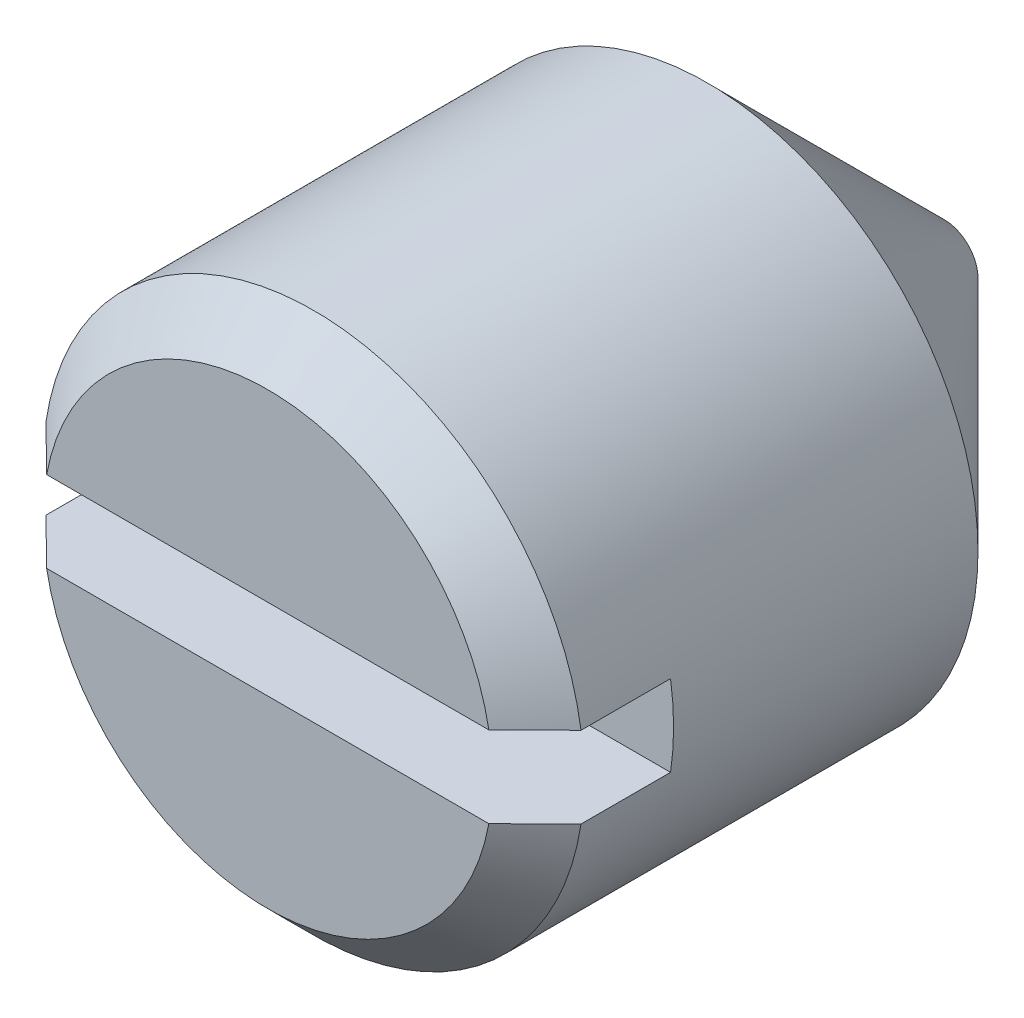
ISO-10303-21;
HEADER;
FILE_DESCRIPTION(('STEP AP214'),'2;1');
FILE_NAME('part.step','',(''),(''),'','','');
FILE_SCHEMA(('AUTOMOTIVE_DESIGN { 1 0 10303 214 1 1 1 1 }'));
ENDSEC;
DATA;
#1=APPLICATION_CONTEXT('core data for automotive mechanical design processes');
#2=APPLICATION_PROTOCOL_DEFINITION('international standard','automotive_design',2000,#1);
#3=PRODUCT_CONTEXT('',#1,'mechanical');
#4=PRODUCT('Part','Part','',(#3));
#5=PRODUCT_RELATED_PRODUCT_CATEGORY('part','',(#4));
#6=PRODUCT_DEFINITION_FORMATION('','',#4);
#7=PRODUCT_DEFINITION_CONTEXT('part definition',#1,'design');
#8=PRODUCT_DEFINITION('design','',#6,#7);
#9=PRODUCT_DEFINITION_SHAPE('','',#8);
#10=(LENGTH_UNIT() NAMED_UNIT(*) SI_UNIT(.MILLI.,.METRE.));
#11=(NAMED_UNIT(*) PLANE_ANGLE_UNIT() SI_UNIT($,.RADIAN.));
#12=(NAMED_UNIT(*) SI_UNIT($,.STERADIAN.) SOLID_ANGLE_UNIT());
#13=UNCERTAINTY_MEASURE_WITH_UNIT(LENGTH_MEASURE(1.E-05),#10,'distance_accuracy_value','');
#14=(GEOMETRIC_REPRESENTATION_CONTEXT(3) GLOBAL_UNCERTAINTY_ASSIGNED_CONTEXT((#13)) GLOBAL_UNIT_ASSIGNED_CONTEXT((#10,
#11,#12)) REPRESENTATION_CONTEXT('',''));
#15=CARTESIAN_POINT('',(0.,0.,0.));
#16=DIRECTION('',(0.,0.,1.));
#17=DIRECTION('',(1.,0.,0.));
#18=AXIS2_PLACEMENT_3D('',#15,#16,#17);
#19=CARTESIAN_POINT('',(0.,0.,10.));
#20=DIRECTION('',(0.,0.,-1.));
#21=DIRECTION('',(-1.,0.,0.));
#22=AXIS2_PLACEMENT_3D('',#19,#20,#21);
#23=CONICAL_SURFACE('',#22,3.3235,0.785398163397453);
#24=CARTESIAN_POINT('',(0.,0.,9.32350000000001));
#25=DIRECTION('',(0.,0.,-1.));
#26=DIRECTION('',(-1.,0.,0.));
#27=AXIS2_PLACEMENT_3D('',#24,#25,#26);
#28=CIRCLE('',#27,4.);
#29=CARTESIAN_POINT('',(3.95474398665703,-0.6,9.32350000000001));
#30=VERTEX_POINT('',#29);
#31=CARTESIAN_POINT('',(-3.95474398665703,-0.6,9.32350000000001));
#32=VERTEX_POINT('',#31);
#33=EDGE_CURVE('E182',#30,#32,#28,.T.);
#34=ORIENTED_EDGE('',*,*,#33,.F.);
#35=CARTESIAN_POINT('',(3.9554519956637,-0.6,9.32280000000001));
#36=CARTESIAN_POINT('',(3.83941046333202,-0.6,9.43752374272301));
#37=CARTESIAN_POINT('',(3.72331727644601,-0.6,9.55219532012046));
#38=CARTESIAN_POINT('',(3.49091447337824,-0.6,9.78145115927556));
#39=CARTESIAN_POINT('',(3.3746047716733,-0.6,9.89603533432413));
#40=CARTESIAN_POINT('',(3.14054409492931,-0.6,10.1262258270565));
#41=CARTESIAN_POINT('',(3.022790996544,-0.6,10.2418299875299));
#42=CARTESIAN_POINT('',(2.78706506673118,-0.6,10.4726808676111));
#43=CARTESIAN_POINT('',(2.66909239652134,-0.6,10.5879277519337));
#44=CARTESIAN_POINT('',(2.38769992620086,-0.6,10.8618597219309));
#45=CARTESIAN_POINT('',(2.2240974048582,-0.6,11.0203578165943));
#46=CARTESIAN_POINT('',(1.9774569607638,-0.6,11.2571454730036));
#47=CARTESIAN_POINT('',(1.89495476016298,-0.6,11.3359926583805));
#48=CARTESIAN_POINT('',(1.72944434813202,-0.6,11.4931193261474));
#49=CARTESIAN_POINT('',(1.64643625080239,-0.6,11.5713989284209));
#50=CARTESIAN_POINT('',(1.48033289556101,-0.6,11.7264690618642));
#51=CARTESIAN_POINT('',(1.39724415616354,-0.6,11.8032665693216));
#52=CARTESIAN_POINT('',(1.2297853450309,-0.6,11.9556053270812));
#53=CARTESIAN_POINT('',(1.14541426762372,-0.6,12.031145482503));
#54=CARTESIAN_POINT('',(1.01743134646914,-0.6,12.1425099641613));
#55=CARTESIAN_POINT('',(0.974611495734269,-0.6,12.1792423835056));
#56=CARTESIAN_POINT('',(0.88825104914351,-0.6,12.2518476767111));
#57=CARTESIAN_POINT('',(0.844710515697685,-0.6,12.2877206243496));
#58=CARTESIAN_POINT('',(0.756681258371002,-0.6,12.3581657820395));
#59=CARTESIAN_POINT('',(0.712193871561131,-0.6,12.3927396574367));
#60=CARTESIAN_POINT('',(0.62179157525006,-0.6,12.4599590373226));
#61=CARTESIAN_POINT('',(0.575877459200435,-0.6,12.4926055853703));
#62=CARTESIAN_POINT('',(0.517059951645175,-0.6,12.5314937537464));
#63=CARTESIAN_POINT('',(0.505142621870374,-0.6,12.5392273325744));
#64=CARTESIAN_POINT('',(0.481156176551866,-0.6,12.5544583662325));
#65=CARTESIAN_POINT('',(0.469087043503605,-0.6,12.561955793476));
#66=CARTESIAN_POINT('',(0.432629404821609,-0.6,12.5840451067196));
#67=CARTESIAN_POINT('',(0.407992687254,-0.6,12.5982326688884));
#68=CARTESIAN_POINT('',(0.358127971712815,-0.6,12.6250606077163));
#69=CARTESIAN_POINT('',(0.332906072222428,-0.6,12.6377121723893));
#70=CARTESIAN_POINT('',(0.281592686747,-0.6,12.6611006298287));
#71=CARTESIAN_POINT('',(0.255501528047126,-0.6,12.6718382337644));
#72=CARTESIAN_POINT('',(0.193854994248767,-0.6,12.6938112268491));
#73=CARTESIAN_POINT('',(0.157946120964675,-0.6,12.7041034569655));
#74=CARTESIAN_POINT('',(0.084989394957498,-0.6,12.718552818474));
#75=CARTESIAN_POINT('',(0.0479465551411075,-0.6,12.7227338256007));
#76=CARTESIAN_POINT('',(-0.0264554180619804,-0.6,12.7240737494915));
#77=CARTESIAN_POINT('',(-0.0638152153471472,-0.6,12.7211987153009));
#78=CARTESIAN_POINT('',(-0.137530412054305,-0.6,12.7090268726957));
#79=CARTESIAN_POINT('',(-0.173882014185233,-0.6,12.6997085158188));
#80=CARTESIAN_POINT('',(-0.246261807890684,-0.6,12.6758675535749));
#81=CARTESIAN_POINT('',(-0.282227687721285,-0.6,12.6611642809327));
#82=CARTESIAN_POINT('',(-0.352560099197905,-0.6,12.6282807391703));
#83=CARTESIAN_POINT('',(-0.386923584223777,-0.6,12.6100941576384));
#84=CARTESIAN_POINT('',(-0.454569244815084,-0.6,12.5712625879236));
#85=CARTESIAN_POINT('',(-0.48784071852055,-0.6,12.5505992934551));
#86=CARTESIAN_POINT('',(-0.5532994244046,-0.6,12.507699102073));
#87=CARTESIAN_POINT('',(-0.585487560938725,-0.6,12.4854635682811));
#88=CARTESIAN_POINT('',(-0.651811050812726,-0.6,12.4379053406815));
#89=CARTESIAN_POINT('',(-0.685873744154424,-0.6,12.412482032828));
#90=CARTESIAN_POINT('',(-0.753285871740464,-0.6,12.3607035685851));
#91=CARTESIAN_POINT('',(-0.786635207970039,-0.6,12.3343482854463));
#92=CARTESIAN_POINT('',(-0.885905678006241,-0.6,12.2542557203946));
#93=CARTESIAN_POINT('',(-0.951015893840077,-0.6,12.1995164981191));
#94=CARTESIAN_POINT('',(-1.08003348059121,-0.6,12.0884240231404));
#95=CARTESIAN_POINT('',(-1.14393845062491,-0.6,12.0320680181171));
#96=CARTESIAN_POINT('',(-1.27086154759114,-0.6,11.9184047652277));
#97=CARTESIAN_POINT('',(-1.33387992843737,-0.6,11.8610978003982));
#98=CARTESIAN_POINT('',(-1.45913765605589,-0.6,11.7460095688462));
#99=CARTESIAN_POINT('',(-1.52137875245095,-0.6,11.6882301998081));
#100=CARTESIAN_POINT('',(-1.64544200782522,-0.6,11.5722149537443));
#101=CARTESIAN_POINT('',(-1.70726413591976,-0.6,11.5139790437322));
#102=CARTESIAN_POINT('',(-1.89214348903176,-0.6,11.3389033424467));
#103=CARTESIAN_POINT('',(-2.01474045607509,-0.6,11.2215780351948));
#104=CARTESIAN_POINT('',(-2.2898215808238,-0.6,10.9567317868721));
#105=CARTESIAN_POINT('',(-2.44210553785073,-0.6,10.8090035494681));
#106=CARTESIAN_POINT('',(-2.74608630308553,-0.6,10.5128359299456));
#107=CARTESIAN_POINT('',(-2.89778288038418,-0.6,10.3643963111344));
#108=CARTESIAN_POINT('',(-3.2006555174332,-0.6,10.0672234994621));
#109=CARTESIAN_POINT('',(-3.35183189106326,-0.6,9.91849062621054));
#110=CARTESIAN_POINT('',(-3.65384879384603,-0.6,9.6207979410559));
#111=CARTESIAN_POINT('',(-3.80468942810255,-0.6,9.47183823581275));
#112=CARTESIAN_POINT('',(-3.9554519956637,-0.6,9.32280000000001));
#113=B_SPLINE_CURVE_WITH_KNOTS('',3,(#35,#36,#37,#38,#39,#40,#41,#42,#43,#44,#45,#46,#47,#48,
#49,#50,#51,#52,#53,#54,#55,#56,#57,#58,#59,#60,#61,#62,#63,#64,#65,#66,#67,#68,#69,#70,#71,#72,
#73,#74,#75,#76,#77,#78,#79,#80,#81,#82,#83,#84,#85,#86,#87,#88,#89,#90,#91,#92,#93,#94,#95,#96,
#97,#98,#99,#100,#101,#102,#103,#104,#105,#106,#107,#108,#109,#110,#111,#112),.UNSPECIFIED.,.F.,
.F.,(4,2,2,2,2,2,2,2,2,2,2,2,2,2,2,2,2,2,2,2,2,2,2,2,2,2,2,2,2,2,2,2,2,2,2,2,2,2,4),(0.,
0.489535110388019,0.97934854211419,1.47439453757313,1.96916156380817,2.6525194368105,
2.99487953820201,3.33716508765002,3.67659181146514,4.01630008313525,4.18554223501366,
4.35476980666316,4.52377247123949,4.69268277314396,4.73530049589485,4.77792317882212,
4.86317585557757,4.94776464552401,5.03232193904806,5.14397626704692,5.25519319957528,
5.36694631337366,5.47907498324324,5.59537395340157,5.71188570813479,5.82931897363021,
5.94665164491658,6.07414183521146,6.20164943148785,6.45678921958667,6.71239265937742,
6.96792134131196,7.22269628283677,7.4774898054105,7.98655823679329,8.62305059489469,
9.25977190721763,9.89599619954656,10.5319807013042),.UNSPECIFIED.);
#114=CARTESIAN_POINT('',(3.26889159349159,-0.6,10.));
#115=VERTEX_POINT('',#114);
#116=EDGE_CURVE('E77',#30,#115,#113,.T.);
#117=ORIENTED_EDGE('',*,*,#116,.T.);
#118=CARTESIAN_POINT('',(0.,0.,10.));
#119=DIRECTION('',(0.,0.,-1.));
#120=DIRECTION('',(-1.,0.,0.));
#121=AXIS2_PLACEMENT_3D('',#118,#119,#120);
#122=CIRCLE('',#121,3.3235);
#123=CARTESIAN_POINT('',(-3.26889159349159,-0.6,10.));
#124=VERTEX_POINT('',#123);
#125=EDGE_CURVE('E215',#115,#124,#122,.T.);
#126=ORIENTED_EDGE('',*,*,#125,.T.);
#127=EDGE_CURVE('E204',#124,#32,#113,.T.);
#128=ORIENTED_EDGE('',*,*,#127,.T.);
#129=EDGE_LOOP('',(#34,#117,#126,#128));
#130=FACE_BOUND('',#129,.T.);
#131=ADVANCED_FACE('F52',(#130),#23,.T.);
#132=CARTESIAN_POINT('',(0.,0.,10.));
#133=DIRECTION('',(0.,0.,1.));
#134=DIRECTION('',(1.,0.,0.));
#135=AXIS2_PLACEMENT_3D('',#132,#133,#134);
#136=PLANE('',#135);
#137=DIRECTION('',(1.,0.,0.));
#138=VECTOR('',#137,1.);
#139=CARTESIAN_POINT('',(0.,-0.6,10.));
#140=LINE('',#139,#138);
#141=EDGE_CURVE('E198',#124,#115,#140,.T.);
#142=ORIENTED_EDGE('',*,*,#141,.F.);
#143=ORIENTED_EDGE('',*,*,#125,.F.);
#144=EDGE_LOOP('',(#142,#143));
#145=FACE_BOUND('',#144,.T.);
#146=ADVANCED_FACE('F160',(#145),#136,.T.);
#147=CARTESIAN_POINT('',(0.,0.,10.));
#148=DIRECTION('',(0.,0.,-1.));
#149=DIRECTION('',(-1.,0.,0.));
#150=AXIS2_PLACEMENT_3D('',#147,#148,#149);
#151=CYLINDRICAL_SURFACE('',#150,4.);
#152=CARTESIAN_POINT('',(0.,0.,3.5));
#153=DIRECTION('',(0.,0.,1.));
#154=DIRECTION('',(1.,0.,0.));
#155=AXIS2_PLACEMENT_3D('',#152,#153,#154);
#156=CIRCLE('',#155,4.);
#157=CARTESIAN_POINT('',(4.,0.,3.5));
#158=VERTEX_POINT('',#157);
#159=EDGE_CURVE('E181',#158,#158,#156,.T.);
#160=ORIENTED_EDGE('',*,*,#159,.T.);
#161=EDGE_LOOP('',(#160));
#162=FACE_BOUND('',#161,.T.);
#163=DIRECTION('',(0.,0.,-1.));
#164=VECTOR('',#163,1.);
#165=CARTESIAN_POINT('',(3.95474398665704,0.6,10.));
#166=LINE('',#165,#164);
#167=CARTESIAN_POINT('',(3.95474398665703,0.6,9.32350000000001));
#168=VERTEX_POINT('',#167);
#169=CARTESIAN_POINT('',(3.95474398665704,0.6,8.));
#170=VERTEX_POINT('',#169);
#171=EDGE_CURVE('E124',#168,#170,#166,.T.);
#172=ORIENTED_EDGE('',*,*,#171,.T.);
#173=CARTESIAN_POINT('',(0.,0.,8.));
#174=DIRECTION('',(0.,0.,-1.));
#175=DIRECTION('',(-1.,0.,0.));
#176=AXIS2_PLACEMENT_3D('',#173,#174,#175);
#177=CIRCLE('',#176,4.);
#178=CARTESIAN_POINT('',(3.95474398665704,-0.6,8.));
#179=VERTEX_POINT('',#178);
#180=EDGE_CURVE('E57',#170,#179,#177,.T.);
#181=ORIENTED_EDGE('',*,*,#180,.T.);
#182=DIRECTION('',(0.,0.,-1.));
#183=VECTOR('',#182,1.);
#184=CARTESIAN_POINT('',(3.95474398665704,-0.6,10.));
#185=LINE('',#184,#183);
#186=EDGE_CURVE('E202',#179,#30,#185,.F.);
#187=ORIENTED_EDGE('',*,*,#186,.T.);
#188=ORIENTED_EDGE('',*,*,#33,.T.);
#189=DIRECTION('',(0.,0.,-1.));
#190=VECTOR('',#189,1.);
#191=CARTESIAN_POINT('',(-3.95474398665704,-0.6,10.));
#192=LINE('',#191,#190);
#193=CARTESIAN_POINT('',(-3.95474398665704,-0.6,8.));
#194=VERTEX_POINT('',#193);
#195=EDGE_CURVE('E113',#32,#194,#192,.T.);
#196=ORIENTED_EDGE('',*,*,#195,.T.);
#197=CARTESIAN_POINT('',(-3.95474398665704,0.6,8.));
#198=VERTEX_POINT('',#197);
#199=EDGE_CURVE('E12',#194,#198,#177,.T.);
#200=ORIENTED_EDGE('',*,*,#199,.T.);
#201=DIRECTION('',(0.,0.,-1.));
#202=VECTOR('',#201,1.);
#203=CARTESIAN_POINT('',(-3.95474398665704,0.6,10.));
#204=LINE('',#203,#202);
#205=CARTESIAN_POINT('',(-3.95474398665703,0.6,9.32350000000001));
#206=VERTEX_POINT('',#205);
#207=EDGE_CURVE('E110',#198,#206,#204,.F.);
#208=ORIENTED_EDGE('',*,*,#207,.T.);
#209=EDGE_CURVE('E177',#206,#168,#28,.T.);
#210=ORIENTED_EDGE('',*,*,#209,.T.);
#211=EDGE_LOOP('',(#172,#181,#187,#188,#196,#200,#208,#210));
#212=FACE_BOUND('',#211,.T.);
#213=ADVANCED_FACE('F108',(#162,#212),#151,.T.);
#214=CARTESIAN_POINT('',(0.,0.,0.));
#215=DIRECTION('',(0.,0.,1.));
#216=DIRECTION('',(1.,0.,0.));
#217=AXIS2_PLACEMENT_3D('',#214,#215,#216);
#218=PLANE('',#217);
#219=CARTESIAN_POINT('',(0.,0.,0.));
#220=DIRECTION('',(0.,0.,1.));
#221=DIRECTION('',(1.,0.,0.));
#222=AXIS2_PLACEMENT_3D('',#219,#220,#221);
#223=CIRCLE('',#222,0.499999999999987);
#224=CARTESIAN_POINT('',(0.499999999999986,0.,0.));
#225=VERTEX_POINT('',#224);
#226=EDGE_CURVE('E187',#225,#225,#223,.F.);
#227=ORIENTED_EDGE('',*,*,#226,.T.);
#228=EDGE_LOOP('',(#227));
#229=FACE_BOUND('',#228,.T.);
#230=ADVANCED_FACE('F168',(#229),#218,.F.);
#231=ORIENTED_EDGE('',*,*,#209,.F.);
#232=CARTESIAN_POINT('',(-3.9554519956637,0.6,9.32280000000001));
#233=CARTESIAN_POINT('',(-3.83941046333203,0.6,9.43752374272301));
#234=CARTESIAN_POINT('',(-3.72331727644601,0.6,9.55219532012046));
#235=CARTESIAN_POINT('',(-3.49091447337824,0.6,9.78145115927556));
#236=CARTESIAN_POINT('',(-3.37460477167329,0.6,9.89603533432413));
#237=CARTESIAN_POINT('',(-3.14054409492931,0.6,10.1262258270565));
#238=CARTESIAN_POINT('',(-3.022790996544,0.6,10.2418299875299));
#239=CARTESIAN_POINT('',(-2.78706506673118,0.6,10.4726808676111));
#240=CARTESIAN_POINT('',(-2.66909239652134,0.6,10.5879277519337));
#241=CARTESIAN_POINT('',(-2.38769992620086,0.6,10.8618597219309));
#242=CARTESIAN_POINT('',(-2.22409740485819,0.6,11.0203578165943));
#243=CARTESIAN_POINT('',(-1.9774569607638,0.6,11.2571454730036));
#244=CARTESIAN_POINT('',(-1.89495476016298,0.6,11.3359926583805));
#245=CARTESIAN_POINT('',(-1.72944434813202,0.6,11.4931193261474));
#246=CARTESIAN_POINT('',(-1.64643625080239,0.6,11.5713989284209));
#247=CARTESIAN_POINT('',(-1.48033289556101,0.6,11.7264690618642));
#248=CARTESIAN_POINT('',(-1.39724415616353,0.6,11.8032665693216));
#249=CARTESIAN_POINT('',(-1.22978534503089,0.6,11.9556053270812));
#250=CARTESIAN_POINT('',(-1.14541426762372,0.6,12.031145482503));
#251=CARTESIAN_POINT('',(-1.01743134646913,0.6,12.1425099641613));
#252=CARTESIAN_POINT('',(-0.974611495734269,0.6,12.1792423835056));
#253=CARTESIAN_POINT('',(-0.88825104914351,0.6,12.2518476767111));
#254=CARTESIAN_POINT('',(-0.844710515697686,0.6,12.2877206243496));
#255=CARTESIAN_POINT('',(-0.756681258371003,0.6,12.3581657820395));
#256=CARTESIAN_POINT('',(-0.712193871561131,0.6,12.3927396574367));
#257=CARTESIAN_POINT('',(-0.621791575250061,0.6,12.4599590373226));
#258=CARTESIAN_POINT('',(-0.575877459200435,0.6,12.4926055853703));
#259=CARTESIAN_POINT('',(-0.517059951645175,0.6,12.5314937537464));
#260=CARTESIAN_POINT('',(-0.505142621870373,0.6,12.5392273325744));
#261=CARTESIAN_POINT('',(-0.481156176551866,0.6,12.5544583662325));
#262=CARTESIAN_POINT('',(-0.469087043503604,0.6,12.561955793476));
#263=CARTESIAN_POINT('',(-0.432629404821609,0.6,12.5840451067196));
#264=CARTESIAN_POINT('',(-0.407992687253999,0.6,12.5982326688884));
#265=CARTESIAN_POINT('',(-0.358127971712815,0.6,12.6250606077163));
#266=CARTESIAN_POINT('',(-0.332906072222428,0.6,12.6377121723893));
#267=CARTESIAN_POINT('',(-0.281592686747,0.6,12.6611006298287));
#268=CARTESIAN_POINT('',(-0.255501528047125,0.6,12.6718382337644));
#269=CARTESIAN_POINT('',(-0.193854994248766,0.6,12.6938112268491));
#270=CARTESIAN_POINT('',(-0.157946120964674,0.6,12.7041034569655));
#271=CARTESIAN_POINT('',(-0.0849893949574976,0.6,12.718552818474));
#272=CARTESIAN_POINT('',(-0.0479465551411072,0.6,12.7227338256007));
#273=CARTESIAN_POINT('',(0.0264554180619803,0.6,12.7240737494915));
#274=CARTESIAN_POINT('',(0.0638152153471468,0.6,12.7211987153009));
#275=CARTESIAN_POINT('',(0.137530412054304,0.6,12.7090268726957));
#276=CARTESIAN_POINT('',(0.173882014185233,0.6,12.6997085158188));
#277=CARTESIAN_POINT('',(0.246261807890685,0.6,12.6758675535749));
#278=CARTESIAN_POINT('',(0.282227687721285,0.6,12.6611642809327));
#279=CARTESIAN_POINT('',(0.352560099197906,0.6,12.6282807391703));
#280=CARTESIAN_POINT('',(0.386923584223778,0.6,12.6100941576384));
#281=CARTESIAN_POINT('',(0.454569244815085,0.6,12.5712625879236));
#282=CARTESIAN_POINT('',(0.487840718520551,0.6,12.5505992934551));
#283=CARTESIAN_POINT('',(0.553299424404601,0.6,12.507699102073));
#284=CARTESIAN_POINT('',(0.585487560938725,0.6,12.4854635682811));
#285=CARTESIAN_POINT('',(0.651811050812726,0.6,12.4379053406815));
#286=CARTESIAN_POINT('',(0.685873744154425,0.6,12.412482032828));
#287=CARTESIAN_POINT('',(0.753285871740466,0.6,12.3607035685851));
#288=CARTESIAN_POINT('',(0.78663520797004,0.6,12.3343482854463));
#289=CARTESIAN_POINT('',(0.885905678006242,0.6,12.2542557203946));
#290=CARTESIAN_POINT('',(0.951015893840078,0.6,12.1995164981191));
#291=CARTESIAN_POINT('',(1.08003348059122,0.6,12.0884240231404));
#292=CARTESIAN_POINT('',(1.14393845062491,0.6,12.0320680181171));
#293=CARTESIAN_POINT('',(1.27086154759114,0.6,11.9184047652277));
#294=CARTESIAN_POINT('',(1.33387992843737,0.6,11.8610978003982));
#295=CARTESIAN_POINT('',(1.45913765605589,0.6,11.7460095688462));
#296=CARTESIAN_POINT('',(1.52137875245095,0.6,11.6882301998081));
#297=CARTESIAN_POINT('',(1.64544200782522,0.6,11.5722149537443));
#298=CARTESIAN_POINT('',(1.70726413591976,0.6,11.5139790437322));
#299=CARTESIAN_POINT('',(1.89214348903176,0.6,11.3389033424467));
#300=CARTESIAN_POINT('',(2.01474045607509,0.6,11.2215780351948));
#301=CARTESIAN_POINT('',(2.2898215808238,0.6,10.9567317868721));
#302=CARTESIAN_POINT('',(2.44210553785073,0.6,10.8090035494681));
#303=CARTESIAN_POINT('',(2.74608630308553,0.6,10.5128359299456));
#304=CARTESIAN_POINT('',(2.89778288038418,0.6,10.3643963111344));
#305=CARTESIAN_POINT('',(3.2006555174332,0.6,10.0672234994621));
#306=CARTESIAN_POINT('',(3.35183189106326,0.6,9.91849062621054));
#307=CARTESIAN_POINT('',(3.65384879384603,0.6,9.6207979410559));
#308=CARTESIAN_POINT('',(3.80468942810256,0.6,9.47183823581275));
#309=CARTESIAN_POINT('',(3.9554519956637,0.6,9.32280000000001));
#310=B_SPLINE_CURVE_WITH_KNOTS('',3,(#232,#233,#234,#235,#236,#237,#238,#239,#240,#241,#242,
#243,#244,#245,#246,#247,#248,#249,#250,#251,#252,#253,#254,#255,#256,#257,#258,#259,#260,#261,
#262,#263,#264,#265,#266,#267,#268,#269,#270,#271,#272,#273,#274,#275,#276,#277,#278,#279,#280,
#281,#282,#283,#284,#285,#286,#287,#288,#289,#290,#291,#292,#293,#294,#295,#296,#297,#298,#299,
#300,#301,#302,#303,#304,#305,#306,#307,#308,#309),.UNSPECIFIED.,.F.,.F.,(4,2,2,2,2,2,2,2,2,2,2,
2,2,2,2,2,2,2,2,2,2,2,2,2,2,2,2,2,2,2,2,2,2,2,2,2,2,2,4),(0.,0.489535110388021,0.97934854211419,
1.47439453757313,1.96916156380817,2.6525194368105,2.99487953820201,3.33716508765002,
3.67659181146514,4.01630008313525,4.18554223501367,4.35476980666316,4.52377247123949,
4.69268277314396,4.73530049589485,4.77792317882212,4.86317585557757,4.94776464552401,
5.03232193904806,5.14397626704692,5.25519319957528,5.36694631337366,5.47907498324324,
5.59537395340157,5.71188570813479,5.82931897363021,5.94665164491658,6.07414183521146,
6.20164943148785,6.45678921958668,6.71239265937743,6.96792134131196,7.22269628283677,
7.4774898054105,7.98655823679329,8.62305059489469,9.25977190721763,9.89599619954656,
10.5319807013042),.UNSPECIFIED.);
#311=CARTESIAN_POINT('',(-3.26889159349159,0.6,10.));
#312=VERTEX_POINT('',#311);
#313=EDGE_CURVE('E122',#206,#312,#310,.T.);
#314=ORIENTED_EDGE('',*,*,#313,.T.);
#315=CARTESIAN_POINT('',(3.26889159349159,0.6,10.));
#316=VERTEX_POINT('',#315);
#317=EDGE_CURVE('E189',#312,#316,#122,.T.);
#318=ORIENTED_EDGE('',*,*,#317,.T.);
#319=EDGE_CURVE('E69',#316,#168,#310,.T.);
#320=ORIENTED_EDGE('',*,*,#319,.T.);
#321=EDGE_LOOP('',(#231,#314,#318,#320));
#322=FACE_BOUND('',#321,.T.);
#323=ADVANCED_FACE('F142',(#322),#23,.T.);
#324=DIRECTION('',(-1.,0.,0.));
#325=VECTOR('',#324,1.);
#326=CARTESIAN_POINT('',(0.,0.6,10.));
#327=LINE('',#326,#325);
#328=EDGE_CURVE('E196',#316,#312,#327,.T.);
#329=ORIENTED_EDGE('',*,*,#328,.F.);
#330=ORIENTED_EDGE('',*,*,#317,.F.);
#331=EDGE_LOOP('',(#329,#330));
#332=FACE_BOUND('',#331,.T.);
#333=ADVANCED_FACE('F157',(#332),#136,.T.);
#334=CARTESIAN_POINT('',(0.,0.,3.5));
#335=DIRECTION('',(0.,0.,1.));
#336=DIRECTION('',(1.,0.,0.));
#337=AXIS2_PLACEMENT_3D('',#334,#335,#336);
#338=CONICAL_SURFACE('',#337,4.,0.78539816339745);
#339=CARTESIAN_POINT('',(0.499999999999986,0.,0.));
#340=CARTESIAN_POINT('',(0.53645833333332,0.,0.0364583333333334));
#341=CARTESIAN_POINT('',(0.572916666666653,0.,0.0729166666666667));
#342=CARTESIAN_POINT('',(0.64583333333332,0.,0.145833333333333));
#343=CARTESIAN_POINT('',(0.682291666666654,0.,0.182291666666667));
#344=CARTESIAN_POINT('',(0.755208333333321,0.,0.255208333333334));
#345=CARTESIAN_POINT('',(0.791666666666654,0.,0.291666666666667));
#346=CARTESIAN_POINT('',(0.864583333333321,0.,0.364583333333334));
#347=CARTESIAN_POINT('',(0.901041666666655,0.,0.401041666666667));
#348=CARTESIAN_POINT('',(0.973958333333322,0.,0.473958333333334));
#349=CARTESIAN_POINT('',(1.01041666666666,0.,0.510416666666667));
#350=CARTESIAN_POINT('',(1.08333333333332,0.,0.583333333333334));
#351=CARTESIAN_POINT('',(1.11979166666666,0.,0.619791666666667));
#352=CARTESIAN_POINT('',(1.19270833333332,0.,0.692708333333333));
#353=CARTESIAN_POINT('',(1.22916666666666,0.,0.729166666666667));
#354=CARTESIAN_POINT('',(1.30208333333332,0.,0.802083333333334));
#355=CARTESIAN_POINT('',(1.33854166666666,0.,0.838541666666667));
#356=CARTESIAN_POINT('',(1.41145833333332,0.,0.911458333333334));
#357=CARTESIAN_POINT('',(1.44791666666666,0.,0.947916666666667));
#358=CARTESIAN_POINT('',(1.52083333333332,0.,1.02083333333333));
#359=CARTESIAN_POINT('',(1.55729166666666,0.,1.05729166666667));
#360=CARTESIAN_POINT('',(1.63020833333332,0.,1.13020833333333));
#361=CARTESIAN_POINT('',(1.66666666666666,0.,1.16666666666667));
#362=CARTESIAN_POINT('',(1.73958333333332,0.,1.23958333333333));
#363=CARTESIAN_POINT('',(1.77604166666666,0.,1.27604166666667));
#364=CARTESIAN_POINT('',(1.84895833333332,0.,1.34895833333333));
#365=CARTESIAN_POINT('',(1.88541666666666,0.,1.38541666666667));
#366=CARTESIAN_POINT('',(1.95833333333333,0.,1.45833333333333));
#367=CARTESIAN_POINT('',(1.99479166666666,0.,1.49479166666667));
#368=CARTESIAN_POINT('',(2.06770833333333,0.,1.56770833333333));
#369=CARTESIAN_POINT('',(2.10416666666666,0.,1.60416666666667));
#370=CARTESIAN_POINT('',(2.17708333333333,0.,1.67708333333333));
#371=CARTESIAN_POINT('',(2.21354166666666,0.,1.71354166666667));
#372=CARTESIAN_POINT('',(2.28645833333333,0.,1.78645833333333));
#373=CARTESIAN_POINT('',(2.32291666666666,0.,1.82291666666667));
#374=CARTESIAN_POINT('',(2.39583333333333,0.,1.89583333333333));
#375=CARTESIAN_POINT('',(2.43229166666666,0.,1.93229166666667));
#376=CARTESIAN_POINT('',(2.50520833333333,0.,2.00520833333333));
#377=CARTESIAN_POINT('',(2.54166666666666,0.,2.04166666666667));
#378=CARTESIAN_POINT('',(2.61458333333333,0.,2.11458333333333));
#379=CARTESIAN_POINT('',(2.65104166666666,0.,2.15104166666667));
#380=CARTESIAN_POINT('',(2.72395833333333,0.,2.22395833333333));
#381=CARTESIAN_POINT('',(2.76041666666666,0.,2.26041666666667));
#382=CARTESIAN_POINT('',(2.83333333333333,0.,2.33333333333333));
#383=CARTESIAN_POINT('',(2.86979166666666,0.,2.36979166666667));
#384=CARTESIAN_POINT('',(2.94270833333333,0.,2.44270833333333));
#385=CARTESIAN_POINT('',(2.97916666666666,0.,2.47916666666667));
#386=CARTESIAN_POINT('',(3.05208333333333,0.,2.55208333333333));
#387=CARTESIAN_POINT('',(3.08854166666666,0.,2.58854166666667));
#388=CARTESIAN_POINT('',(3.16145833333333,0.,2.66145833333333));
#389=CARTESIAN_POINT('',(3.19791666666666,0.,2.69791666666667));
#390=CARTESIAN_POINT('',(3.27083333333333,0.,2.77083333333333));
#391=CARTESIAN_POINT('',(3.30729166666666,0.,2.80729166666667));
#392=CARTESIAN_POINT('',(3.38020833333333,0.,2.88020833333333));
#393=CARTESIAN_POINT('',(3.41666666666666,0.,2.91666666666667));
#394=CARTESIAN_POINT('',(3.48958333333333,0.,2.98958333333333));
#395=CARTESIAN_POINT('',(3.52604166666666,0.,3.02604166666667));
#396=CARTESIAN_POINT('',(3.59895833333333,0.,3.09895833333333));
#397=CARTESIAN_POINT('',(3.63541666666666,0.,3.13541666666667));
#398=CARTESIAN_POINT('',(3.70833333333333,0.,3.20833333333333));
#399=CARTESIAN_POINT('',(3.74479166666667,0.,3.24479166666667));
#400=CARTESIAN_POINT('',(3.81770833333333,0.,3.31770833333333));
#401=CARTESIAN_POINT('',(3.85416666666667,0.,3.35416666666667));
#402=CARTESIAN_POINT('',(3.92708333333333,0.,3.42708333333333));
#403=CARTESIAN_POINT('',(3.96354166666667,0.,3.46354166666667));
#404=CARTESIAN_POINT('',(4.,0.,3.5));
#405=B_SPLINE_CURVE_WITH_KNOTS('',3,(#339,#340,#341,#342,#343,#344,#345,#346,#347,#348,#349,
#350,#351,#352,#353,#354,#355,#356,#357,#358,#359,#360,#361,#362,#363,#364,#365,#366,#367,#368,
#369,#370,#371,#372,#373,#374,#375,#376,#377,#378,#379,#380,#381,#382,#383,#384,#385,#386,#387,
#388,#389,#390,#391,#392,#393,#394,#395,#396,#397,#398,#399,#400,#401,#402,#403,#404),
.UNSPECIFIED.,.F.,.F.,(4,2,2,2,2,2,2,2,2,2,2,2,2,2,2,2,2,2,2,2,2,2,2,2,2,2,2,2,2,2,2,2,4),(0.,
0.154679608384558,0.309359216769115,0.464038825153673,0.618718433538231,0.773398041922789,
0.928077650307346,1.0827572586919,1.23743686707646,1.39211647546102,1.54679608384558,
1.70147569223013,1.85615530061469,2.01083490899925,2.16551451738381,2.32019412576836,
2.47487373415292,2.62955334253748,2.78423295092204,2.9389125593066,3.09359216769115,
3.24827177607571,3.40295138446027,3.55763099284483,3.71231060122938,3.86699020961394,
4.0216698179985,4.17634942638306,4.33102903476761,4.48570864315217,4.64038825153673,
4.79506785992129,4.94974746830584),.UNSPECIFIED.);
#406=EDGE_CURVE('BSEAM55',#225,#158,#405,.T.);
#407=ORIENTED_EDGE('',*,*,#226,.F.);
#408=ORIENTED_EDGE('',*,*,#159,.F.);
#409=ORIENTED_EDGE('',*,*,#406,.T.);
#410=ORIENTED_EDGE('',*,*,#406,.F.);
#411=EDGE_LOOP('',(#407,#409,#408,#410));
#412=FACE_BOUND('',#411,.T.);
#413=ADVANCED_FACE('F55',(#412),#338,.T.);
#414=CARTESIAN_POINT('',(-4.,-0.6,8.));
#415=DIRECTION('',(0.,0.,-1.));
#416=DIRECTION('',(-1.,0.,0.));
#417=AXIS2_PLACEMENT_3D('',#414,#415,#416);
#418=PLANE('',#417);
#419=DIRECTION('',(1.,0.,0.));
#420=VECTOR('',#419,1.);
#421=CARTESIAN_POINT('',(-4.,0.6,8.));
#422=LINE('',#421,#420);
#423=EDGE_CURVE('E120',#198,#170,#422,.T.);
#424=ORIENTED_EDGE('',*,*,#423,.F.);
#425=ORIENTED_EDGE('',*,*,#199,.F.);
#426=DIRECTION('',(1.,0.,0.));
#427=VECTOR('',#426,1.);
#428=CARTESIAN_POINT('',(-4.,-0.6,8.));
#429=LINE('',#428,#427);
#430=EDGE_CURVE('E129',#194,#179,#429,.T.);
#431=ORIENTED_EDGE('',*,*,#430,.T.);
#432=ORIENTED_EDGE('',*,*,#180,.F.);
#433=EDGE_LOOP('',(#424,#425,#431,#432));
#434=FACE_BOUND('',#433,.T.);
#435=ADVANCED_FACE('F126',(#434),#418,.F.);
#436=CARTESIAN_POINT('',(-4.,-0.6,12.));
#437=DIRECTION('',(0.,-1.,0.));
#438=DIRECTION('',(0.,0.,-1.));
#439=AXIS2_PLACEMENT_3D('',#436,#437,#438);
#440=PLANE('',#439);
#441=ORIENTED_EDGE('',*,*,#127,.F.);
#442=ORIENTED_EDGE('',*,*,#141,.T.);
#443=ORIENTED_EDGE('',*,*,#116,.F.);
#444=ORIENTED_EDGE('',*,*,#186,.F.);
#445=ORIENTED_EDGE('',*,*,#430,.F.);
#446=ORIENTED_EDGE('',*,*,#195,.F.);
#447=EDGE_LOOP('',(#441,#442,#443,#444,#445,#446));
#448=FACE_BOUND('',#447,.T.);
#449=ADVANCED_FACE('F149',(#448),#440,.F.);
#450=CARTESIAN_POINT('',(-4.,0.6,12.));
#451=DIRECTION('',(0.,1.,0.));
#452=DIRECTION('',(0.,0.,1.));
#453=AXIS2_PLACEMENT_3D('',#450,#451,#452);
#454=PLANE('',#453);
#455=ORIENTED_EDGE('',*,*,#319,.F.);
#456=ORIENTED_EDGE('',*,*,#328,.T.);
#457=ORIENTED_EDGE('',*,*,#313,.F.);
#458=ORIENTED_EDGE('',*,*,#207,.F.);
#459=ORIENTED_EDGE('',*,*,#423,.T.);
#460=ORIENTED_EDGE('',*,*,#171,.F.);
#461=EDGE_LOOP('',(#455,#456,#457,#458,#459,#460));
#462=FACE_BOUND('',#461,.T.);
#463=ADVANCED_FACE('F119',(#462),#454,.F.);
#464=CLOSED_SHELL('',(#131,#146,#213,#230,#323,#333,#413,#435,#449,#463));
#465=MANIFOLD_SOLID_BREP('B2',#464);
#466=ADVANCED_BREP_SHAPE_REPRESENTATION('',(#18,#465),#14);
#467=SHAPE_DEFINITION_REPRESENTATION(#9,#466);
ENDSEC;
END-ISO-10303-21;
